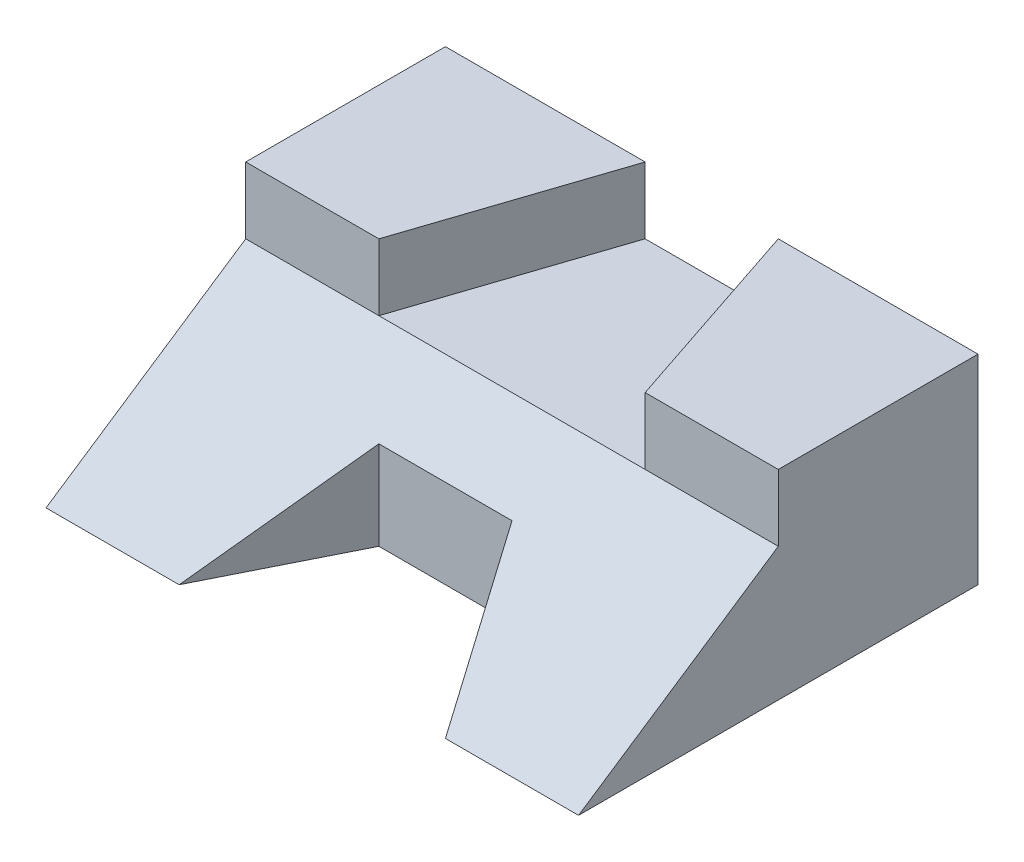
ISO-10303-21;
HEADER;
FILE_DESCRIPTION(('STEP AP214'),'2;1');
FILE_NAME('part.step','',(''),(''),'','','');
FILE_SCHEMA(('AUTOMOTIVE_DESIGN { 1 0 10303 214 1 1 1 1 }'));
ENDSEC;
DATA;
#1=APPLICATION_CONTEXT('core data for automotive mechanical design processes');
#2=APPLICATION_PROTOCOL_DEFINITION('international standard','automotive_design',2000,#1);
#3=PRODUCT_CONTEXT('',#1,'mechanical');
#4=PRODUCT('Part','Part','',(#3));
#5=PRODUCT_RELATED_PRODUCT_CATEGORY('part','',(#4));
#6=PRODUCT_DEFINITION_FORMATION('','',#4);
#7=PRODUCT_DEFINITION_CONTEXT('part definition',#1,'design');
#8=PRODUCT_DEFINITION('design','',#6,#7);
#9=PRODUCT_DEFINITION_SHAPE('','',#8);
#10=(LENGTH_UNIT() NAMED_UNIT(*) SI_UNIT(.MILLI.,.METRE.));
#11=(NAMED_UNIT(*) PLANE_ANGLE_UNIT() SI_UNIT($,.RADIAN.));
#12=(NAMED_UNIT(*) SI_UNIT($,.STERADIAN.) SOLID_ANGLE_UNIT());
#13=UNCERTAINTY_MEASURE_WITH_UNIT(LENGTH_MEASURE(1.E-05),#10,'distance_accuracy_value','');
#14=(GEOMETRIC_REPRESENTATION_CONTEXT(3) GLOBAL_UNCERTAINTY_ASSIGNED_CONTEXT((#13)) GLOBAL_UNIT_ASSIGNED_CONTEXT((#10,
#11,#12)) REPRESENTATION_CONTEXT('',''));
#15=CARTESIAN_POINT('',(0.,0.,0.));
#16=DIRECTION('',(0.,0.,1.));
#17=DIRECTION('',(1.,0.,0.));
#18=AXIS2_PLACEMENT_3D('',#15,#16,#17);
#19=CARTESIAN_POINT('',(80.,30.,0.));
#20=DIRECTION('',(0.,-1.,0.));
#21=DIRECTION('',(0.,0.,-1.));
#22=AXIS2_PLACEMENT_3D('',#19,#20,#21);
#23=PLANE('',#22);
#24=DIRECTION('',(0.316227766016838,0.,0.948683298050514));
#25=VECTOR('',#24,1.);
#26=CARTESIAN_POINT('',(50.,30.,0.));
#27=LINE('',#26,#25);
#28=CARTESIAN_POINT('',(50.,30.,0.));
#29=VERTEX_POINT('',#28);
#30=CARTESIAN_POINT('',(60.,30.,30.));
#31=VERTEX_POINT('',#30);
#32=EDGE_CURVE('E219',#29,#31,#27,.T.);
#33=ORIENTED_EDGE('',*,*,#32,.T.);
#34=DIRECTION('',(-1.,0.,0.));
#35=VECTOR('',#34,1.);
#36=CARTESIAN_POINT('',(80.,30.,30.));
#37=LINE('',#36,#35);
#38=CARTESIAN_POINT('',(80.,30.,30.));
#39=VERTEX_POINT('',#38);
#40=EDGE_CURVE('E165',#39,#31,#37,.T.);
#41=ORIENTED_EDGE('',*,*,#40,.F.);
#42=DIRECTION('',(0.,0.,1.));
#43=VECTOR('',#42,1.);
#44=CARTESIAN_POINT('',(80.,30.,0.));
#45=LINE('',#44,#43);
#46=CARTESIAN_POINT('',(80.,30.,0.));
#47=VERTEX_POINT('',#46);
#48=EDGE_CURVE('E204',#47,#39,#45,.T.);
#49=ORIENTED_EDGE('',*,*,#48,.F.);
#50=DIRECTION('',(-1.,0.,0.));
#51=VECTOR('',#50,1.);
#52=CARTESIAN_POINT('',(80.,30.,0.));
#53=LINE('',#52,#51);
#54=EDGE_CURVE('E47',#47,#29,#53,.T.);
#55=ORIENTED_EDGE('',*,*,#54,.T.);
#56=EDGE_LOOP('',(#33,#41,#49,#55));
#57=FACE_BOUND('',#56,.T.);
#58=ADVANCED_FACE('F39',(#57),#23,.F.);
#59=CARTESIAN_POINT('',(80.,30.,30.));
#60=DIRECTION('',(0.,0.,-1.));
#61=DIRECTION('',(-1.,0.,0.));
#62=AXIS2_PLACEMENT_3D('',#59,#60,#61);
#63=PLANE('',#62);
#64=DIRECTION('',(0.,1.,0.));
#65=VECTOR('',#64,1.);
#66=CARTESIAN_POINT('',(60.,20.,30.));
#67=LINE('',#66,#65);
#68=CARTESIAN_POINT('',(60.,20.,30.));
#69=VERTEX_POINT('',#68);
#70=EDGE_CURVE('E212',#69,#31,#67,.T.);
#71=ORIENTED_EDGE('',*,*,#70,.F.);
#72=DIRECTION('',(-1.,0.,0.));
#73=VECTOR('',#72,1.);
#74=CARTESIAN_POINT('',(80.,20.,30.));
#75=LINE('',#74,#73);
#76=CARTESIAN_POINT('',(80.,20.,30.));
#77=VERTEX_POINT('',#76);
#78=EDGE_CURVE('E156',#77,#69,#75,.T.);
#79=ORIENTED_EDGE('',*,*,#78,.F.);
#80=DIRECTION('',(0.,-1.,0.));
#81=VECTOR('',#80,1.);
#82=CARTESIAN_POINT('',(80.,30.,30.));
#83=LINE('',#82,#81);
#84=EDGE_CURVE('E202',#39,#77,#83,.T.);
#85=ORIENTED_EDGE('',*,*,#84,.F.);
#86=ORIENTED_EDGE('',*,*,#40,.T.);
#87=EDGE_LOOP('',(#71,#79,#85,#86));
#88=FACE_BOUND('',#87,.T.);
#89=ADVANCED_FACE('F256',(#88),#63,.F.);
#90=CARTESIAN_POINT('',(80.,0.,60.));
#91=DIRECTION('',(0.,1.,0.));
#92=DIRECTION('',(0.,0.,1.));
#93=AXIS2_PLACEMENT_3D('',#90,#91,#92);
#94=PLANE('',#93);
#95=DIRECTION('',(1.,0.,0.));
#96=VECTOR('',#95,1.);
#97=CARTESIAN_POINT('',(30.,0.,40.));
#98=LINE('',#97,#96);
#99=CARTESIAN_POINT('',(30.,0.,40.));
#100=VERTEX_POINT('',#99);
#101=CARTESIAN_POINT('',(50.,0.,40.));
#102=VERTEX_POINT('',#101);
#103=EDGE_CURVE('E137',#100,#102,#98,.T.);
#104=ORIENTED_EDGE('',*,*,#103,.F.);
#105=DIRECTION('',(0.447213595499958,0.,-0.894427190999916));
#106=VECTOR('',#105,1.);
#107=CARTESIAN_POINT('',(20.,0.,60.));
#108=LINE('',#107,#106);
#109=CARTESIAN_POINT('',(20.,0.,60.));
#110=VERTEX_POINT('',#109);
#111=EDGE_CURVE('E231',#110,#100,#108,.T.);
#112=ORIENTED_EDGE('',*,*,#111,.F.);
#113=DIRECTION('',(-1.,0.,0.));
#114=VECTOR('',#113,1.);
#115=CARTESIAN_POINT('',(80.,0.,60.));
#116=LINE('',#115,#114);
#117=CARTESIAN_POINT('',(0.,0.,60.));
#118=VERTEX_POINT('',#117);
#119=EDGE_CURVE('E154',#110,#118,#116,.T.);
#120=ORIENTED_EDGE('',*,*,#119,.T.);
#121=DIRECTION('',(0.,0.,-1.));
#122=VECTOR('',#121,1.);
#123=CARTESIAN_POINT('',(0.,0.,60.));
#124=LINE('',#123,#122);
#125=CARTESIAN_POINT('',(0.,0.,0.));
#126=VERTEX_POINT('',#125);
#127=EDGE_CURVE('E191',#118,#126,#124,.T.);
#128=ORIENTED_EDGE('',*,*,#127,.T.);
#129=DIRECTION('',(-1.,0.,0.));
#130=VECTOR('',#129,1.);
#131=CARTESIAN_POINT('',(80.,0.,0.));
#132=LINE('',#131,#130);
#133=CARTESIAN_POINT('',(80.,0.,0.));
#134=VERTEX_POINT('',#133);
#135=EDGE_CURVE('E11',#134,#126,#132,.T.);
#136=ORIENTED_EDGE('',*,*,#135,.F.);
#137=DIRECTION('',(0.,0.,-1.));
#138=VECTOR('',#137,1.);
#139=CARTESIAN_POINT('',(80.,0.,60.));
#140=LINE('',#139,#138);
#141=CARTESIAN_POINT('',(80.,0.,60.));
#142=VERTEX_POINT('',#141);
#143=EDGE_CURVE('E152',#142,#134,#140,.T.);
#144=ORIENTED_EDGE('',*,*,#143,.F.);
#145=CARTESIAN_POINT('',(60.,0.,60.));
#146=VERTEX_POINT('',#145);
#147=EDGE_CURVE('E144',#142,#146,#116,.T.);
#148=ORIENTED_EDGE('',*,*,#147,.T.);
#149=DIRECTION('',(-0.447213595499958,0.,-0.894427190999916));
#150=VECTOR('',#149,1.);
#151=CARTESIAN_POINT('',(60.,0.,60.));
#152=LINE('',#151,#150);
#153=EDGE_CURVE('E128',#146,#102,#152,.T.);
#154=ORIENTED_EDGE('',*,*,#153,.T.);
#155=EDGE_LOOP('',(#104,#112,#120,#128,#136,#144,#148,#154));
#156=FACE_BOUND('',#155,.T.);
#157=ADVANCED_FACE('F41',(#156),#94,.F.);
#158=CARTESIAN_POINT('',(80.,0.,0.));
#159=DIRECTION('',(0.,0.,1.));
#160=DIRECTION('',(1.,0.,0.));
#161=AXIS2_PLACEMENT_3D('',#158,#159,#160);
#162=PLANE('',#161);
#163=CARTESIAN_POINT('',(30.,30.,0.));
#164=VERTEX_POINT('',#163);
#165=CARTESIAN_POINT('',(0.,30.,0.));
#166=VERTEX_POINT('',#165);
#167=EDGE_CURVE('E167',#164,#166,#53,.T.);
#168=ORIENTED_EDGE('',*,*,#167,.F.);
#169=DIRECTION('',(0.,1.,0.));
#170=VECTOR('',#169,1.);
#171=CARTESIAN_POINT('',(30.,20.,0.));
#172=LINE('',#171,#170);
#173=CARTESIAN_POINT('',(30.,20.,0.));
#174=VERTEX_POINT('',#173);
#175=EDGE_CURVE('E200',#174,#164,#172,.T.);
#176=ORIENTED_EDGE('',*,*,#175,.F.);
#177=DIRECTION('',(-1.,0.,0.));
#178=VECTOR('',#177,1.);
#179=CARTESIAN_POINT('',(50.,20.,0.));
#180=LINE('',#179,#178);
#181=CARTESIAN_POINT('',(50.,20.,0.));
#182=VERTEX_POINT('',#181);
#183=EDGE_CURVE('E213',#182,#174,#180,.T.);
#184=ORIENTED_EDGE('',*,*,#183,.F.);
#185=DIRECTION('',(0.,1.,0.));
#186=VECTOR('',#185,1.);
#187=CARTESIAN_POINT('',(50.,20.,0.));
#188=LINE('',#187,#186);
#189=EDGE_CURVE('E215',#182,#29,#188,.T.);
#190=ORIENTED_EDGE('',*,*,#189,.T.);
#191=ORIENTED_EDGE('',*,*,#54,.F.);
#192=DIRECTION('',(0.,1.,0.));
#193=VECTOR('',#192,1.);
#194=CARTESIAN_POINT('',(80.,0.,0.));
#195=LINE('',#194,#193);
#196=EDGE_CURVE('E206',#134,#47,#195,.T.);
#197=ORIENTED_EDGE('',*,*,#196,.F.);
#198=ORIENTED_EDGE('',*,*,#135,.T.);
#199=DIRECTION('',(0.,1.,0.));
#200=VECTOR('',#199,1.);
#201=CARTESIAN_POINT('',(0.,0.,0.));
#202=LINE('',#201,#200);
#203=EDGE_CURVE('E186',#126,#166,#202,.T.);
#204=ORIENTED_EDGE('',*,*,#203,.T.);
#205=EDGE_LOOP('',(#168,#176,#184,#190,#191,#197,#198,#204));
#206=FACE_BOUND('',#205,.T.);
#207=ADVANCED_FACE('F187',(#206),#162,.F.);
#208=CARTESIAN_POINT('',(20.,30.,30.));
#209=VERTEX_POINT('',#208);
#210=CARTESIAN_POINT('',(0.,30.,30.));
#211=VERTEX_POINT('',#210);
#212=EDGE_CURVE('E164',#209,#211,#37,.T.);
#213=ORIENTED_EDGE('',*,*,#212,.F.);
#214=DIRECTION('',(-0.316227766016838,0.,0.948683298050514));
#215=VECTOR('',#214,1.);
#216=CARTESIAN_POINT('',(30.,30.,0.));
#217=LINE('',#216,#215);
#218=EDGE_CURVE('E183',#164,#209,#217,.T.);
#219=ORIENTED_EDGE('',*,*,#218,.F.);
#220=ORIENTED_EDGE('',*,*,#167,.T.);
#221=DIRECTION('',(0.,0.,1.));
#222=VECTOR('',#221,1.);
#223=CARTESIAN_POINT('',(0.,30.,0.));
#224=LINE('',#223,#222);
#225=EDGE_CURVE('E181',#166,#211,#224,.T.);
#226=ORIENTED_EDGE('',*,*,#225,.T.);
#227=EDGE_LOOP('',(#213,#219,#220,#226));
#228=FACE_BOUND('',#227,.T.);
#229=ADVANCED_FACE('F179',(#228),#23,.F.);
#230=CARTESIAN_POINT('',(20.,20.,30.));
#231=VERTEX_POINT('',#230);
#232=CARTESIAN_POINT('',(0.,20.,30.));
#233=VERTEX_POINT('',#232);
#234=EDGE_CURVE('E153',#231,#233,#75,.T.);
#235=ORIENTED_EDGE('',*,*,#234,.F.);
#236=DIRECTION('',(0.,1.,0.));
#237=VECTOR('',#236,1.);
#238=CARTESIAN_POINT('',(20.,20.,30.));
#239=LINE('',#238,#237);
#240=EDGE_CURVE('E209',#231,#209,#239,.T.);
#241=ORIENTED_EDGE('',*,*,#240,.T.);
#242=ORIENTED_EDGE('',*,*,#212,.T.);
#243=DIRECTION('',(0.,-1.,0.));
#244=VECTOR('',#243,1.);
#245=CARTESIAN_POINT('',(0.,30.,30.));
#246=LINE('',#245,#244);
#247=EDGE_CURVE('E196',#211,#233,#246,.T.);
#248=ORIENTED_EDGE('',*,*,#247,.T.);
#249=EDGE_LOOP('',(#235,#241,#242,#248));
#250=FACE_BOUND('',#249,.T.);
#251=ADVANCED_FACE('F244',(#250),#63,.F.);
#252=CARTESIAN_POINT('',(80.,20.,30.));
#253=DIRECTION('',(0.,-0.832050294337844,-0.554700196225229));
#254=DIRECTION('',(0.,0.554700196225229,-0.832050294337844));
#255=AXIS2_PLACEMENT_3D('',#252,#253,#254);
#256=PLANE('',#255);
#257=ORIENTED_EDGE('',*,*,#119,.F.);
#258=DIRECTION('',(-0.384110639798688,-0.512147519731584,0.768221279597376));
#259=VECTOR('',#258,1.);
#260=CARTESIAN_POINT('',(25.9018360655738,7.86911475409836,48.1963278688524));
#261=LINE('',#260,#259);
#262=CARTESIAN_POINT('',(30.,13.3333333333333,40.));
#263=VERTEX_POINT('',#262);
#264=EDGE_CURVE('E148',#263,#110,#261,.T.);
#265=ORIENTED_EDGE('',*,*,#264,.F.);
#266=DIRECTION('',(-1.,0.,0.));
#267=VECTOR('',#266,1.);
#268=CARTESIAN_POINT('',(30.,13.3333333333333,40.));
#269=LINE('',#268,#267);
#270=CARTESIAN_POINT('',(50.,13.3333333333333,40.));
#271=VERTEX_POINT('',#270);
#272=EDGE_CURVE('E147',#271,#263,#269,.T.);
#273=ORIENTED_EDGE('',*,*,#272,.F.);
#274=DIRECTION('',(0.384110639798688,-0.512147519731584,0.768221279597376));
#275=VECTOR('',#274,1.);
#276=CARTESIAN_POINT('',(54.0981639344262,7.86911475409836,48.1963278688525));
#277=LINE('',#276,#275);
#278=EDGE_CURVE('E131',#271,#146,#277,.T.);
#279=ORIENTED_EDGE('',*,*,#278,.T.);
#280=ORIENTED_EDGE('',*,*,#147,.F.);
#281=DIRECTION('',(0.,-0.554700196225229,0.832050294337844));
#282=VECTOR('',#281,1.);
#283=CARTESIAN_POINT('',(80.,20.,30.));
#284=LINE('',#283,#282);
#285=EDGE_CURVE('E158',#77,#142,#284,.T.);
#286=ORIENTED_EDGE('',*,*,#285,.F.);
#287=ORIENTED_EDGE('',*,*,#78,.T.);
#288=DIRECTION('',(1.,0.,0.));
#289=VECTOR('',#288,1.);
#290=CARTESIAN_POINT('',(20.,20.,30.));
#291=LINE('',#290,#289);
#292=EDGE_CURVE('E225',#231,#69,#291,.T.);
#293=ORIENTED_EDGE('',*,*,#292,.F.);
#294=ORIENTED_EDGE('',*,*,#234,.T.);
#295=DIRECTION('',(0.,-0.554700196225229,0.832050294337844));
#296=VECTOR('',#295,1.);
#297=CARTESIAN_POINT('',(0.,20.,30.));
#298=LINE('',#297,#296);
#299=EDGE_CURVE('E160',#233,#118,#298,.T.);
#300=ORIENTED_EDGE('',*,*,#299,.T.);
#301=EDGE_LOOP('',(#257,#265,#273,#279,#280,#286,#287,#293,#294,#300));
#302=FACE_BOUND('',#301,.T.);
#303=ADVANCED_FACE('F142',(#302),#256,.F.);
#304=CARTESIAN_POINT('',(80.,0.,0.));
#305=DIRECTION('',(1.,0.,0.));
#306=DIRECTION('',(0.,0.,-1.));
#307=AXIS2_PLACEMENT_3D('',#304,#305,#306);
#308=PLANE('',#307);
#309=ORIENTED_EDGE('',*,*,#143,.T.);
#310=ORIENTED_EDGE('',*,*,#196,.T.);
#311=ORIENTED_EDGE('',*,*,#48,.T.);
#312=ORIENTED_EDGE('',*,*,#84,.T.);
#313=ORIENTED_EDGE('',*,*,#285,.T.);
#314=EDGE_LOOP('',(#309,#310,#311,#312,#313));
#315=FACE_BOUND('',#314,.T.);
#316=ADVANCED_FACE('F259',(#315),#308,.T.);
#317=CARTESIAN_POINT('',(0.,0.,0.));
#318=DIRECTION('',(1.,0.,0.));
#319=DIRECTION('',(0.,0.,-1.));
#320=AXIS2_PLACEMENT_3D('',#317,#318,#319);
#321=PLANE('',#320);
#322=ORIENTED_EDGE('',*,*,#127,.F.);
#323=ORIENTED_EDGE('',*,*,#299,.F.);
#324=ORIENTED_EDGE('',*,*,#247,.F.);
#325=ORIENTED_EDGE('',*,*,#225,.F.);
#326=ORIENTED_EDGE('',*,*,#203,.F.);
#327=EDGE_LOOP('',(#322,#323,#324,#325,#326));
#328=FACE_BOUND('',#327,.T.);
#329=ADVANCED_FACE('F193',(#328),#321,.F.);
#330=CARTESIAN_POINT('',(30.,20.,0.));
#331=DIRECTION('',(-0.948683298050514,0.,-0.316227766016838));
#332=DIRECTION('',(-0.316227766016838,0.,0.948683298050514));
#333=AXIS2_PLACEMENT_3D('',#330,#331,#332);
#334=PLANE('',#333);
#335=ORIENTED_EDGE('',*,*,#218,.T.);
#336=ORIENTED_EDGE('',*,*,#240,.F.);
#337=DIRECTION('',(-0.316227766016838,0.,0.948683298050514));
#338=VECTOR('',#337,1.);
#339=CARTESIAN_POINT('',(30.,20.,0.));
#340=LINE('',#339,#338);
#341=EDGE_CURVE('E62',#174,#231,#340,.T.);
#342=ORIENTED_EDGE('',*,*,#341,.F.);
#343=ORIENTED_EDGE('',*,*,#175,.T.);
#344=EDGE_LOOP('',(#335,#336,#342,#343));
#345=FACE_BOUND('',#344,.T.);
#346=ADVANCED_FACE('F246',(#345),#334,.F.);
#347=CARTESIAN_POINT('',(50.,20.,0.));
#348=DIRECTION('',(-0.948683298050514,0.,0.316227766016838));
#349=DIRECTION('',(0.316227766016838,0.,0.948683298050514));
#350=AXIS2_PLACEMENT_3D('',#347,#348,#349);
#351=PLANE('',#350);
#352=ORIENTED_EDGE('',*,*,#32,.F.);
#353=ORIENTED_EDGE('',*,*,#189,.F.);
#354=DIRECTION('',(0.316227766016838,0.,0.948683298050514));
#355=VECTOR('',#354,1.);
#356=CARTESIAN_POINT('',(50.,20.,0.));
#357=LINE('',#356,#355);
#358=EDGE_CURVE('E223',#182,#69,#357,.T.);
#359=ORIENTED_EDGE('',*,*,#358,.T.);
#360=ORIENTED_EDGE('',*,*,#70,.T.);
#361=EDGE_LOOP('',(#352,#353,#359,#360));
#362=FACE_BOUND('',#361,.T.);
#363=ADVANCED_FACE('F252',(#362),#351,.T.);
#364=CARTESIAN_POINT('',(0.,20.,0.));
#365=DIRECTION('',(0.,1.,0.));
#366=DIRECTION('',(0.,0.,1.));
#367=AXIS2_PLACEMENT_3D('',#364,#365,#366);
#368=PLANE('',#367);
#369=ORIENTED_EDGE('',*,*,#341,.T.);
#370=ORIENTED_EDGE('',*,*,#292,.T.);
#371=ORIENTED_EDGE('',*,*,#358,.F.);
#372=ORIENTED_EDGE('',*,*,#183,.T.);
#373=EDGE_LOOP('',(#369,#370,#371,#372));
#374=FACE_BOUND('',#373,.T.);
#375=ADVANCED_FACE('F249',(#374),#368,.T.);
#376=CARTESIAN_POINT('',(20.,30.001,60.));
#377=DIRECTION('',(-0.894427190999916,0.,-0.447213595499958));
#378=DIRECTION('',(-0.447213595499958,0.,0.894427190999916));
#379=AXIS2_PLACEMENT_3D('',#376,#377,#378);
#380=PLANE('',#379);
#381=ORIENTED_EDGE('',*,*,#264,.T.);
#382=ORIENTED_EDGE('',*,*,#111,.T.);
#383=DIRECTION('',(0.,-1.,0.));
#384=VECTOR('',#383,1.);
#385=CARTESIAN_POINT('',(30.,30.001,40.));
#386=LINE('',#385,#384);
#387=EDGE_CURVE('E136',#263,#100,#386,.T.);
#388=ORIENTED_EDGE('',*,*,#387,.F.);
#389=EDGE_LOOP('',(#381,#382,#388));
#390=FACE_BOUND('',#389,.T.);
#391=ADVANCED_FACE('F238',(#390),#380,.F.);
#392=CARTESIAN_POINT('',(60.,30.001,60.));
#393=DIRECTION('',(-0.894427190999916,0.,0.447213595499958));
#394=DIRECTION('',(0.447213595499958,0.,0.894427190999916));
#395=AXIS2_PLACEMENT_3D('',#392,#393,#394);
#396=PLANE('',#395);
#397=DIRECTION('',(0.,-1.,0.));
#398=VECTOR('',#397,1.);
#399=CARTESIAN_POINT('',(50.,30.001,40.));
#400=LINE('',#399,#398);
#401=EDGE_CURVE('E54',#271,#102,#400,.T.);
#402=ORIENTED_EDGE('',*,*,#401,.T.);
#403=ORIENTED_EDGE('',*,*,#153,.F.);
#404=ORIENTED_EDGE('',*,*,#278,.F.);
#405=EDGE_LOOP('',(#402,#403,#404));
#406=FACE_BOUND('',#405,.T.);
#407=ADVANCED_FACE('F130',(#406),#396,.T.);
#408=CARTESIAN_POINT('',(30.,30.001,40.));
#409=DIRECTION('',(0.,0.,-1.));
#410=DIRECTION('',(-1.,0.,0.));
#411=AXIS2_PLACEMENT_3D('',#408,#409,#410);
#412=PLANE('',#411);
#413=ORIENTED_EDGE('',*,*,#272,.T.);
#414=ORIENTED_EDGE('',*,*,#387,.T.);
#415=ORIENTED_EDGE('',*,*,#103,.T.);
#416=ORIENTED_EDGE('',*,*,#401,.F.);
#417=EDGE_LOOP('',(#413,#414,#415,#416));
#418=FACE_BOUND('',#417,.T.);
#419=ADVANCED_FACE('F236',(#418),#412,.F.);
#420=CLOSED_SHELL('',(#58,#89,#157,#207,#229,#251,#303,#316,#329,#346,#363,#375,#391,#407,#419));
#421=MANIFOLD_SOLID_BREP('B2',#420);
#422=ADVANCED_BREP_SHAPE_REPRESENTATION('',(#18,#421),#14);
#423=SHAPE_DEFINITION_REPRESENTATION(#9,#422);
ENDSEC;
END-ISO-10303-21;
